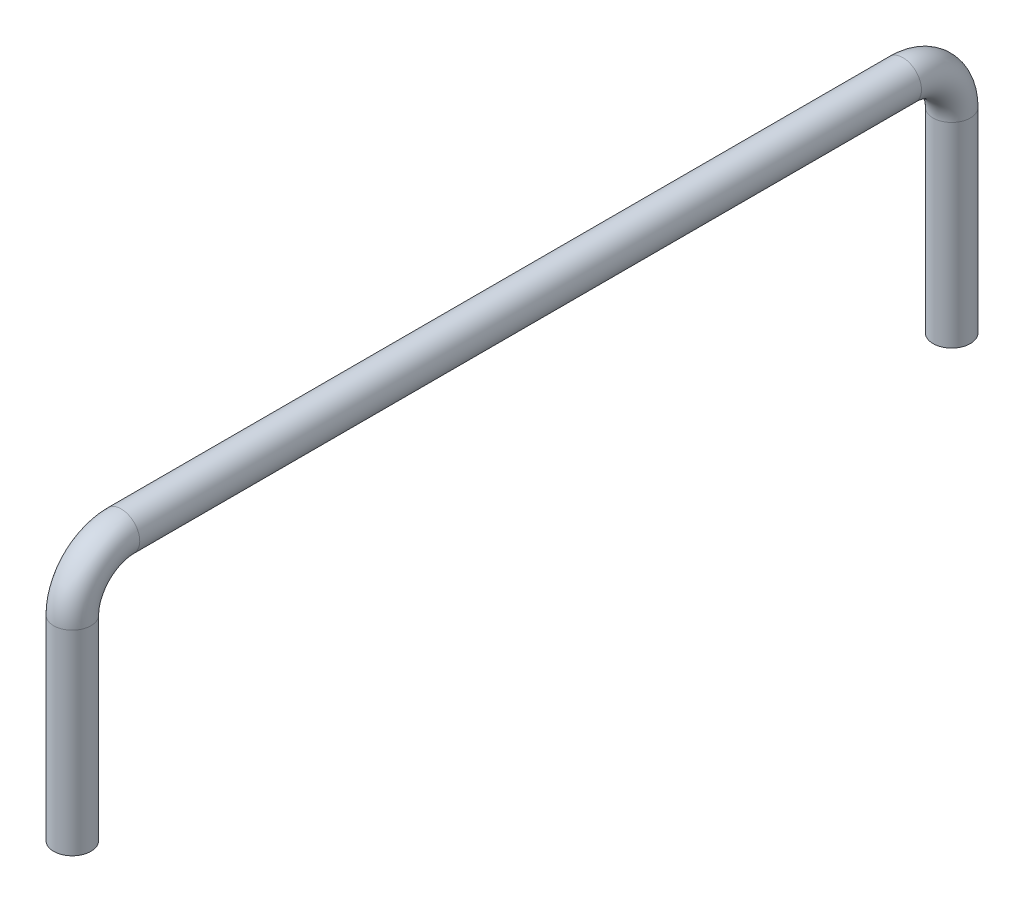
ISO-10303-21;
HEADER;
FILE_DESCRIPTION(('STEP AP214'),'2;1');
FILE_NAME('part.step','',(''),(''),'','','');
FILE_SCHEMA(('AUTOMOTIVE_DESIGN { 1 0 10303 214 1 1 1 1 }'));
ENDSEC;
DATA;
#1=APPLICATION_CONTEXT('core data for automotive mechanical design processes');
#2=APPLICATION_PROTOCOL_DEFINITION('international standard','automotive_design',2000,#1);
#3=PRODUCT_CONTEXT('',#1,'mechanical');
#4=PRODUCT('Part','Part','',(#3));
#5=PRODUCT_RELATED_PRODUCT_CATEGORY('part','',(#4));
#6=PRODUCT_DEFINITION_FORMATION('','',#4);
#7=PRODUCT_DEFINITION_CONTEXT('part definition',#1,'design');
#8=PRODUCT_DEFINITION('design','',#6,#7);
#9=PRODUCT_DEFINITION_SHAPE('','',#8);
#10=(LENGTH_UNIT() NAMED_UNIT(*) SI_UNIT(.MILLI.,.METRE.));
#11=(NAMED_UNIT(*) PLANE_ANGLE_UNIT() SI_UNIT($,.RADIAN.));
#12=(NAMED_UNIT(*) SI_UNIT($,.STERADIAN.) SOLID_ANGLE_UNIT());
#13=UNCERTAINTY_MEASURE_WITH_UNIT(LENGTH_MEASURE(1.E-05),#10,'distance_accuracy_value','');
#14=(GEOMETRIC_REPRESENTATION_CONTEXT(3) GLOBAL_UNCERTAINTY_ASSIGNED_CONTEXT((#13)) GLOBAL_UNIT_ASSIGNED_CONTEXT((#10,
#11,#12)) REPRESENTATION_CONTEXT('',''));
#15=CARTESIAN_POINT('',(0.,0.,0.));
#16=DIRECTION('',(0.,0.,1.));
#17=DIRECTION('',(1.,0.,0.));
#18=AXIS2_PLACEMENT_3D('',#15,#16,#17);
#19=CARTESIAN_POINT('',(0.,4.,-18.));
#20=DIRECTION('',(0.,-1.,0.));
#21=DIRECTION('',(0.,0.,-1.));
#22=AXIS2_PLACEMENT_3D('',#19,#20,#21);
#23=CYLINDRICAL_SURFACE('',#22,0.381);
#24=CARTESIAN_POINT('',(0.,4.,-18.));
#25=DIRECTION('',(0.,-1.,0.));
#26=DIRECTION('',(0.,0.,-1.));
#27=AXIS2_PLACEMENT_3D('',#24,#25,#26);
#28=CIRCLE('',#27,0.381);
#29=CARTESIAN_POINT('',(0.,4.,-18.381));
#30=VERTEX_POINT('',#29);
#31=EDGE_CURVE('E37',#30,#30,#28,.T.);
#32=ORIENTED_EDGE('',*,*,#31,.T.);
#33=EDGE_LOOP('',(#32));
#34=FACE_BOUND('',#33,.T.);
#35=CARTESIAN_POINT('',(0.,0.,-18.));
#36=DIRECTION('',(0.,-1.,0.));
#37=DIRECTION('',(0.,0.,-1.));
#38=AXIS2_PLACEMENT_3D('',#35,#36,#37);
#39=CIRCLE('',#38,0.381);
#40=CARTESIAN_POINT('',(0.,0.,-18.381));
#41=VERTEX_POINT('',#40);
#42=EDGE_CURVE('E10',#41,#41,#39,.T.);
#43=ORIENTED_EDGE('',*,*,#42,.F.);
#44=EDGE_LOOP('',(#43));
#45=FACE_BOUND('',#44,.T.);
#46=ADVANCED_FACE('F31',(#34,#45),#23,.T.);
#47=CARTESIAN_POINT('',(0.,4.,-17.));
#48=DIRECTION('',(-1.,0.,0.));
#49=DIRECTION('',(0.,0.,1.));
#50=AXIS2_PLACEMENT_3D('',#47,#48,#49);
#51=TOROIDAL_SURFACE('',#50,1.,0.381);
#52=CARTESIAN_POINT('',(0.,5.,-17.));
#53=DIRECTION('',(0.,0.,-1.));
#54=DIRECTION('',(0.,1.,0.));
#55=AXIS2_PLACEMENT_3D('',#52,#53,#54);
#56=CIRCLE('',#55,0.381);
#57=CARTESIAN_POINT('',(0.,5.381,-17.));
#58=VERTEX_POINT('',#57);
#59=EDGE_CURVE('E41',#58,#58,#56,.T.);
#60=CARTESIAN_POINT('',(0.,4.,-17.));
#61=DIRECTION('',(-1.,0.,0.));
#62=DIRECTION('',(0.,0.,1.));
#63=AXIS2_PLACEMENT_3D('',#60,#61,#62);
#64=CIRCLE('',#63,1.381);
#65=EDGE_CURVE('',#58,#30,#64,.T.);
#66=ORIENTED_EDGE('',*,*,#59,.T.);
#67=ORIENTED_EDGE('',*,*,#31,.F.);
#68=ORIENTED_EDGE('',*,*,#65,.T.);
#69=ORIENTED_EDGE('',*,*,#65,.F.);
#70=EDGE_LOOP('',(#66,#68,#67,#69));
#71=FACE_BOUND('',#70,.T.);
#72=ADVANCED_FACE('F75',(#71),#51,.T.);
#73=CARTESIAN_POINT('',(0.,5.,-1.));
#74=DIRECTION('',(0.,0.,-1.));
#75=DIRECTION('',(0.,1.,0.));
#76=AXIS2_PLACEMENT_3D('',#73,#74,#75);
#77=CYLINDRICAL_SURFACE('',#76,0.381);
#78=CARTESIAN_POINT('',(0.,5.,-1.));
#79=DIRECTION('',(0.,0.,-1.));
#80=DIRECTION('',(0.,1.,0.));
#81=AXIS2_PLACEMENT_3D('',#78,#79,#80);
#82=CIRCLE('',#81,0.381);
#83=CARTESIAN_POINT('',(0.,5.381,-1.));
#84=VERTEX_POINT('',#83);
#85=EDGE_CURVE('E45',#84,#84,#82,.T.);
#86=ORIENTED_EDGE('',*,*,#85,.T.);
#87=EDGE_LOOP('',(#86));
#88=FACE_BOUND('',#87,.T.);
#89=ORIENTED_EDGE('',*,*,#59,.F.);
#90=EDGE_LOOP('',(#89));
#91=FACE_BOUND('',#90,.T.);
#92=ADVANCED_FACE('F79',(#88,#91),#77,.T.);
#93=CARTESIAN_POINT('',(0.,4.,-1.));
#94=DIRECTION('',(-1.,0.,0.));
#95=DIRECTION('',(0.,0.,1.));
#96=AXIS2_PLACEMENT_3D('',#93,#94,#95);
#97=TOROIDAL_SURFACE('',#96,1.,0.381);
#98=CARTESIAN_POINT('',(0.,4.,0.));
#99=DIRECTION('',(0.,1.,0.));
#100=DIRECTION('',(0.,0.,1.));
#101=AXIS2_PLACEMENT_3D('',#98,#99,#100);
#102=CIRCLE('',#101,0.381);
#103=CARTESIAN_POINT('',(0.,4.,0.381));
#104=VERTEX_POINT('',#103);
#105=EDGE_CURVE('E50',#104,#104,#102,.T.);
#106=CARTESIAN_POINT('',(0.,4.,-1.));
#107=DIRECTION('',(-1.,0.,0.));
#108=DIRECTION('',(0.,0.,1.));
#109=AXIS2_PLACEMENT_3D('',#106,#107,#108);
#110=CIRCLE('',#109,1.381);
#111=EDGE_CURVE('',#104,#84,#110,.T.);
#112=ORIENTED_EDGE('',*,*,#105,.T.);
#113=ORIENTED_EDGE('',*,*,#85,.F.);
#114=ORIENTED_EDGE('',*,*,#111,.T.);
#115=ORIENTED_EDGE('',*,*,#111,.F.);
#116=EDGE_LOOP('',(#112,#114,#113,#115));
#117=FACE_BOUND('',#116,.T.);
#118=ADVANCED_FACE('F57',(#117),#97,.T.);
#119=CARTESIAN_POINT('',(0.,4.,0.));
#120=DIRECTION('',(0.,-1.,0.));
#121=DIRECTION('',(0.,0.,-1.));
#122=AXIS2_PLACEMENT_3D('',#119,#120,#121);
#123=CYLINDRICAL_SURFACE('',#122,0.381);
#124=ORIENTED_EDGE('',*,*,#105,.F.);
#125=EDGE_LOOP('',(#124));
#126=FACE_BOUND('',#125,.T.);
#127=CARTESIAN_POINT('',(0.,0.,0.));
#128=DIRECTION('',(0.,1.,0.));
#129=DIRECTION('',(0.,0.,1.));
#130=AXIS2_PLACEMENT_3D('',#127,#128,#129);
#131=CIRCLE('',#130,0.381);
#132=CARTESIAN_POINT('',(0.,0.,0.381));
#133=VERTEX_POINT('',#132);
#134=EDGE_CURVE('E51',#133,#133,#131,.T.);
#135=ORIENTED_EDGE('',*,*,#134,.T.);
#136=EDGE_LOOP('',(#135));
#137=FACE_BOUND('',#136,.T.);
#138=ADVANCED_FACE('F60',(#126,#137),#123,.T.);
#139=CARTESIAN_POINT('',(0.,0.,-18.));
#140=DIRECTION('',(0.,-1.,0.));
#141=DIRECTION('',(0.,0.,-1.));
#142=AXIS2_PLACEMENT_3D('',#139,#140,#141);
#143=PLANE('',#142);
#144=ORIENTED_EDGE('',*,*,#42,.T.);
#145=EDGE_LOOP('',(#144));
#146=FACE_BOUND('',#145,.T.);
#147=ADVANCED_FACE('F63',(#146),#143,.T.);
#148=CARTESIAN_POINT('',(0.,0.,0.));
#149=DIRECTION('',(0.,1.,0.));
#150=DIRECTION('',(0.,0.,1.));
#151=AXIS2_PLACEMENT_3D('',#148,#149,#150);
#152=PLANE('',#151);
#153=ORIENTED_EDGE('',*,*,#134,.F.);
#154=EDGE_LOOP('',(#153));
#155=FACE_BOUND('',#154,.T.);
#156=ADVANCED_FACE('F67',(#155),#152,.F.);
#157=CLOSED_SHELL('',(#46,#72,#92,#118,#138,#147,#156));
#158=MANIFOLD_SOLID_BREP('B2',#157);
#159=ADVANCED_BREP_SHAPE_REPRESENTATION('',(#18,#158),#14);
#160=SHAPE_DEFINITION_REPRESENTATION(#9,#159);
ENDSEC;
END-ISO-10303-21;
